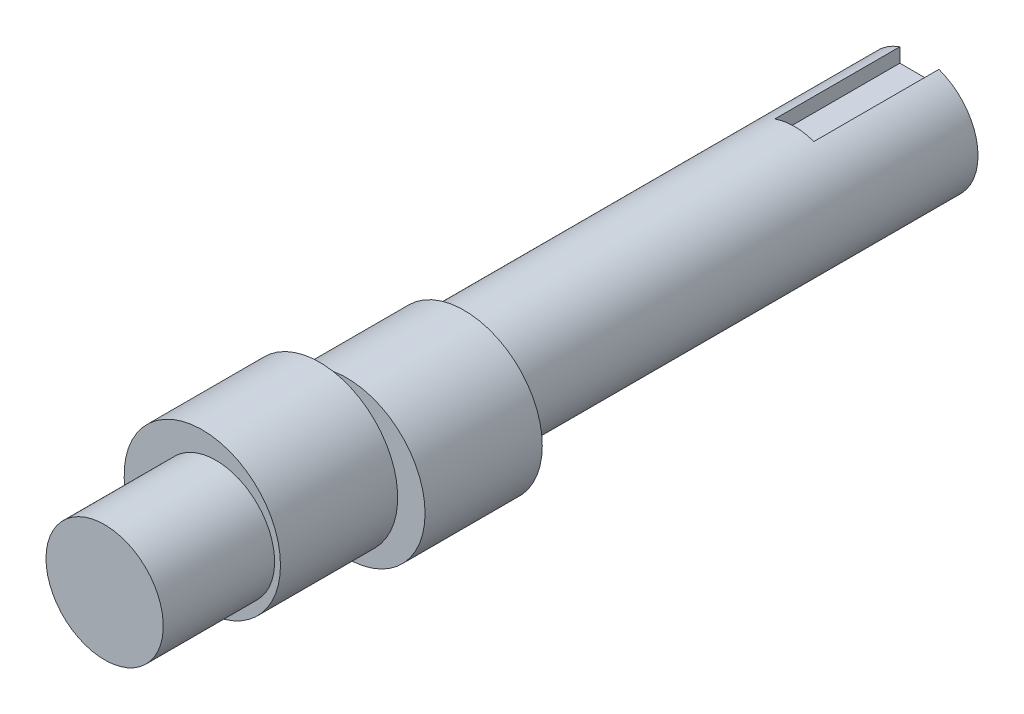
ISO-10303-21;
HEADER;
FILE_DESCRIPTION(('STEP AP214'),'2;1');
FILE_NAME('part.step','',(''),(''),'','','');
FILE_SCHEMA(('AUTOMOTIVE_DESIGN { 1 0 10303 214 1 1 1 1 }'));
ENDSEC;
DATA;
#1=APPLICATION_CONTEXT('core data for automotive mechanical design processes');
#2=APPLICATION_PROTOCOL_DEFINITION('international standard','automotive_design',2000,#1);
#3=PRODUCT_CONTEXT('',#1,'mechanical');
#4=PRODUCT('Part','Part','',(#3));
#5=PRODUCT_RELATED_PRODUCT_CATEGORY('part','',(#4));
#6=PRODUCT_DEFINITION_FORMATION('','',#4);
#7=PRODUCT_DEFINITION_CONTEXT('part definition',#1,'design');
#8=PRODUCT_DEFINITION('design','',#6,#7);
#9=PRODUCT_DEFINITION_SHAPE('','',#8);
#10=(LENGTH_UNIT() NAMED_UNIT(*) SI_UNIT(.MILLI.,.METRE.));
#11=(NAMED_UNIT(*) PLANE_ANGLE_UNIT() SI_UNIT($,.RADIAN.));
#12=(NAMED_UNIT(*) SI_UNIT($,.STERADIAN.) SOLID_ANGLE_UNIT());
#13=UNCERTAINTY_MEASURE_WITH_UNIT(LENGTH_MEASURE(1.E-05),#10,'distance_accuracy_value','');
#14=(GEOMETRIC_REPRESENTATION_CONTEXT(3) GLOBAL_UNCERTAINTY_ASSIGNED_CONTEXT((#13)) GLOBAL_UNIT_ASSIGNED_CONTEXT((#10,
#11,#12)) REPRESENTATION_CONTEXT('',''));
#15=CARTESIAN_POINT('',(0.,0.,0.));
#16=DIRECTION('',(0.,0.,1.));
#17=DIRECTION('',(1.,0.,0.));
#18=AXIS2_PLACEMENT_3D('',#15,#16,#17);
#19=CARTESIAN_POINT('',(0.,0.,60.));
#20=DIRECTION('',(0.,0.,-1.));
#21=DIRECTION('',(-1.,0.,0.));
#22=AXIS2_PLACEMENT_3D('',#19,#20,#21);
#23=CYLINDRICAL_SURFACE('',#22,7.5);
#24=CARTESIAN_POINT('',(0.,0.,60.));
#25=DIRECTION('',(0.,0.,1.));
#26=DIRECTION('',(1.,0.,0.));
#27=AXIS2_PLACEMENT_3D('',#24,#25,#26);
#28=CIRCLE('',#27,7.5);
#29=CARTESIAN_POINT('',(7.5,0.,60.));
#30=VERTEX_POINT('',#29);
#31=EDGE_CURVE('E122',#30,#30,#28,.T.);
#32=ORIENTED_EDGE('',*,*,#31,.F.);
#33=EDGE_LOOP('',(#32));
#34=FACE_BOUND('',#33,.T.);
#35=CARTESIAN_POINT('',(0.,0.,16.));
#36=DIRECTION('',(0.,0.,-1.));
#37=DIRECTION('',(-1.,0.,0.));
#38=AXIS2_PLACEMENT_3D('',#35,#36,#37);
#39=CIRCLE('',#38,7.5);
#40=CARTESIAN_POINT('',(-2.5,7.07106781186548,16.));
#41=VERTEX_POINT('',#40);
#42=CARTESIAN_POINT('',(2.5,7.07106781186548,16.));
#43=VERTEX_POINT('',#42);
#44=EDGE_CURVE('E87',#41,#43,#39,.T.);
#45=ORIENTED_EDGE('',*,*,#44,.F.);
#46=DIRECTION('',(0.,0.,-1.));
#47=VECTOR('',#46,1.);
#48=CARTESIAN_POINT('',(-2.5,7.07106781186548,16.));
#49=LINE('',#48,#47);
#50=CARTESIAN_POINT('',(-2.5,7.07106781186548,0.));
#51=VERTEX_POINT('',#50);
#52=EDGE_CURVE('E109',#41,#51,#49,.T.);
#53=ORIENTED_EDGE('',*,*,#52,.T.);
#54=CARTESIAN_POINT('',(0.,0.,0.));
#55=DIRECTION('',(0.,0.,1.));
#56=DIRECTION('',(1.,0.,0.));
#57=AXIS2_PLACEMENT_3D('',#54,#55,#56);
#58=CIRCLE('',#57,7.5);
#59=CARTESIAN_POINT('',(2.5,7.07106781186547,0.));
#60=VERTEX_POINT('',#59);
#61=EDGE_CURVE('E35',#51,#60,#58,.T.);
#62=ORIENTED_EDGE('',*,*,#61,.T.);
#63=DIRECTION('',(0.,0.,-1.));
#64=VECTOR('',#63,1.);
#65=CARTESIAN_POINT('',(2.5,7.07106781186548,16.));
#66=LINE('',#65,#64);
#67=EDGE_CURVE('E48',#43,#60,#66,.T.);
#68=ORIENTED_EDGE('',*,*,#67,.F.);
#69=EDGE_LOOP('',(#45,#53,#62,#68));
#70=FACE_BOUND('',#69,.T.);
#71=ADVANCED_FACE('F32',(#34,#70),#23,.T.);
#72=CARTESIAN_POINT('',(0.,0.,0.));
#73=DIRECTION('',(0.,0.,1.));
#74=DIRECTION('',(1.,0.,0.));
#75=AXIS2_PLACEMENT_3D('',#72,#73,#74);
#76=PLANE('',#75);
#77=ORIENTED_EDGE('',*,*,#61,.F.);
#78=DIRECTION('',(0.,1.,0.));
#79=VECTOR('',#78,1.);
#80=CARTESIAN_POINT('',(-2.5,5.25,0.));
#81=LINE('',#80,#79);
#82=CARTESIAN_POINT('',(-2.5,5.25,0.));
#83=VERTEX_POINT('',#82);
#84=EDGE_CURVE('E96',#83,#51,#81,.T.);
#85=ORIENTED_EDGE('',*,*,#84,.F.);
#86=DIRECTION('',(-1.,0.,0.));
#87=VECTOR('',#86,1.);
#88=CARTESIAN_POINT('',(2.5,5.25,0.));
#89=LINE('',#88,#87);
#90=CARTESIAN_POINT('',(2.5,5.25,0.));
#91=VERTEX_POINT('',#90);
#92=EDGE_CURVE('E158',#91,#83,#89,.T.);
#93=ORIENTED_EDGE('',*,*,#92,.F.);
#94=DIRECTION('',(0.,-1.,0.));
#95=VECTOR('',#94,1.);
#96=CARTESIAN_POINT('',(2.5,7.07106781186548,0.));
#97=LINE('',#96,#95);
#98=EDGE_CURVE('E156',#60,#91,#97,.T.);
#99=ORIENTED_EDGE('',*,*,#98,.F.);
#100=EDGE_LOOP('',(#77,#85,#93,#99));
#101=FACE_BOUND('',#100,.T.);
#102=ADVANCED_FACE('F143',(#101),#76,.F.);
#103=CARTESIAN_POINT('',(1.75,0.,75.));
#104=DIRECTION('',(0.,0.,-1.));
#105=DIRECTION('',(-1.,0.,0.));
#106=AXIS2_PLACEMENT_3D('',#103,#104,#105);
#107=CYLINDRICAL_SURFACE('',#106,10.);
#108=CARTESIAN_POINT('',(1.75,0.,75.));
#109=DIRECTION('',(0.,0.,1.));
#110=DIRECTION('',(1.,0.,0.));
#111=AXIS2_PLACEMENT_3D('',#108,#109,#110);
#112=CIRCLE('',#111,10.);
#113=CARTESIAN_POINT('',(0.,9.84568433375761,75.));
#114=VERTEX_POINT('',#113);
#115=CARTESIAN_POINT('',(0.,-9.84568433375761,75.));
#116=VERTEX_POINT('',#115);
#117=EDGE_CURVE('E117',#114,#116,#112,.T.);
#118=ORIENTED_EDGE('',*,*,#117,.F.);
#119=EDGE_CURVE('E120',#116,#114,#112,.T.);
#120=ORIENTED_EDGE('',*,*,#119,.F.);
#121=EDGE_LOOP('',(#118,#120));
#122=FACE_BOUND('',#121,.T.);
#123=CARTESIAN_POINT('',(1.75,0.,60.));
#124=DIRECTION('',(0.,0.,1.));
#125=DIRECTION('',(1.,0.,0.));
#126=AXIS2_PLACEMENT_3D('',#123,#124,#125);
#127=CIRCLE('',#126,10.);
#128=CARTESIAN_POINT('',(11.75,0.,60.));
#129=VERTEX_POINT('',#128);
#130=EDGE_CURVE('E114',#129,#129,#127,.T.);
#131=ORIENTED_EDGE('',*,*,#130,.T.);
#132=EDGE_LOOP('',(#131));
#133=FACE_BOUND('',#132,.T.);
#134=ADVANCED_FACE('F132',(#122,#133),#107,.T.);
#135=CARTESIAN_POINT('',(1.75,0.,75.));
#136=DIRECTION('',(0.,0.,1.));
#137=DIRECTION('',(1.,0.,0.));
#138=AXIS2_PLACEMENT_3D('',#135,#136,#137);
#139=PLANE('',#138);
#140=CARTESIAN_POINT('',(-1.75,0.,75.));
#141=DIRECTION('',(0.,0.,1.));
#142=DIRECTION('',(1.,0.,0.));
#143=AXIS2_PLACEMENT_3D('',#140,#141,#142);
#144=CIRCLE('',#143,10.);
#145=EDGE_CURVE('E40',#116,#114,#144,.T.);
#146=ORIENTED_EDGE('',*,*,#145,.F.);
#147=ORIENTED_EDGE('',*,*,#119,.T.);
#148=EDGE_LOOP('',(#146,#147));
#149=FACE_BOUND('',#148,.T.);
#150=ADVANCED_FACE('F134',(#149),#139,.T.);
#151=CARTESIAN_POINT('',(1.75,0.,60.));
#152=DIRECTION('',(0.,0.,1.));
#153=DIRECTION('',(1.,0.,0.));
#154=AXIS2_PLACEMENT_3D('',#151,#152,#153);
#155=PLANE('',#154);
#156=ORIENTED_EDGE('',*,*,#31,.T.);
#157=EDGE_LOOP('',(#156));
#158=FACE_BOUND('',#157,.T.);
#159=ORIENTED_EDGE('',*,*,#130,.F.);
#160=EDGE_LOOP('',(#159));
#161=FACE_BOUND('',#160,.T.);
#162=ADVANCED_FACE('F136',(#158,#161),#155,.F.);
#163=CARTESIAN_POINT('',(-1.75,0.,75.));
#164=DIRECTION('',(0.,0.,1.));
#165=DIRECTION('',(1.,0.,0.));
#166=AXIS2_PLACEMENT_3D('',#163,#164,#165);
#167=PLANE('',#166);
#168=EDGE_CURVE('E108',#114,#116,#144,.T.);
#169=ORIENTED_EDGE('',*,*,#168,.F.);
#170=ORIENTED_EDGE('',*,*,#117,.T.);
#171=EDGE_LOOP('',(#169,#170));
#172=FACE_BOUND('',#171,.T.);
#173=ADVANCED_FACE('F130',(#172),#167,.F.);
#174=CARTESIAN_POINT('',(-1.75,0.,90.));
#175=DIRECTION('',(0.,0.,-1.));
#176=DIRECTION('',(-1.,0.,0.));
#177=AXIS2_PLACEMENT_3D('',#174,#175,#176);
#178=CYLINDRICAL_SURFACE('',#177,10.);
#179=CARTESIAN_POINT('',(-1.75,0.,90.));
#180=DIRECTION('',(0.,0.,1.));
#181=DIRECTION('',(1.,0.,0.));
#182=AXIS2_PLACEMENT_3D('',#179,#180,#181);
#183=CIRCLE('',#182,10.);
#184=CARTESIAN_POINT('',(8.25,0.,90.));
#185=VERTEX_POINT('',#184);
#186=EDGE_CURVE('E111',#185,#185,#183,.T.);
#187=ORIENTED_EDGE('',*,*,#186,.F.);
#188=EDGE_LOOP('',(#187));
#189=FACE_BOUND('',#188,.T.);
#190=ORIENTED_EDGE('',*,*,#168,.T.);
#191=ORIENTED_EDGE('',*,*,#145,.T.);
#192=EDGE_LOOP('',(#190,#191));
#193=FACE_BOUND('',#192,.T.);
#194=ADVANCED_FACE('F128',(#189,#193),#178,.T.);
#195=CARTESIAN_POINT('',(-1.75,0.,90.));
#196=DIRECTION('',(0.,0.,1.));
#197=DIRECTION('',(1.,0.,0.));
#198=AXIS2_PLACEMENT_3D('',#195,#196,#197);
#199=PLANE('',#198);
#200=CARTESIAN_POINT('',(0.,0.,90.));
#201=DIRECTION('',(0.,0.,1.));
#202=DIRECTION('',(1.,0.,0.));
#203=AXIS2_PLACEMENT_3D('',#200,#201,#202);
#204=CIRCLE('',#203,7.5);
#205=CARTESIAN_POINT('',(-7.5,0.,90.));
#206=VERTEX_POINT('',#205);
#207=EDGE_CURVE('E11',#206,#206,#204,.T.);
#208=ORIENTED_EDGE('',*,*,#207,.F.);
#209=EDGE_LOOP('',(#208));
#210=FACE_BOUND('',#209,.T.);
#211=ORIENTED_EDGE('',*,*,#186,.T.);
#212=EDGE_LOOP('',(#211));
#213=FACE_BOUND('',#212,.T.);
#214=ADVANCED_FACE('F185',(#210,#213),#199,.T.);
#215=CARTESIAN_POINT('',(0.,0.,104.25));
#216=DIRECTION('',(0.,0.,-1.));
#217=DIRECTION('',(-1.,0.,0.));
#218=AXIS2_PLACEMENT_3D('',#215,#216,#217);
#219=CYLINDRICAL_SURFACE('',#218,7.5);
#220=CARTESIAN_POINT('',(0.,0.,104.25));
#221=DIRECTION('',(0.,0.,1.));
#222=DIRECTION('',(1.,0.,0.));
#223=AXIS2_PLACEMENT_3D('',#220,#221,#222);
#224=CIRCLE('',#223,7.5);
#225=CARTESIAN_POINT('',(-7.5,0.,104.25));
#226=VERTEX_POINT('',#225);
#227=EDGE_CURVE('E106',#226,#226,#224,.T.);
#228=CARTESIAN_POINT('',(-7.5,0.,104.25));
#229=CARTESIAN_POINT('',(-7.5,0.,104.1015625));
#230=CARTESIAN_POINT('',(-7.5,0.,103.953125));
#231=CARTESIAN_POINT('',(-7.5,0.,103.65625));
#232=CARTESIAN_POINT('',(-7.5,0.,103.5078125));
#233=CARTESIAN_POINT('',(-7.5,0.,103.2109375));
#234=CARTESIAN_POINT('',(-7.5,0.,103.0625));
#235=CARTESIAN_POINT('',(-7.5,0.,102.765625));
#236=CARTESIAN_POINT('',(-7.5,0.,102.6171875));
#237=CARTESIAN_POINT('',(-7.5,0.,102.3203125));
#238=CARTESIAN_POINT('',(-7.5,0.,102.171875));
#239=CARTESIAN_POINT('',(-7.5,0.,101.875));
#240=CARTESIAN_POINT('',(-7.5,0.,101.7265625));
#241=CARTESIAN_POINT('',(-7.5,0.,101.4296875));
#242=CARTESIAN_POINT('',(-7.5,0.,101.28125));
#243=CARTESIAN_POINT('',(-7.5,0.,100.984375));
#244=CARTESIAN_POINT('',(-7.5,0.,100.8359375));
#245=CARTESIAN_POINT('',(-7.5,0.,100.5390625));
#246=CARTESIAN_POINT('',(-7.5,0.,100.390625));
#247=CARTESIAN_POINT('',(-7.5,0.,100.09375));
#248=CARTESIAN_POINT('',(-7.5,0.,99.9453125));
#249=CARTESIAN_POINT('',(-7.5,0.,99.6484375));
#250=CARTESIAN_POINT('',(-7.5,0.,99.5));
#251=CARTESIAN_POINT('',(-7.5,0.,99.203125));
#252=CARTESIAN_POINT('',(-7.5,0.,99.0546875));
#253=CARTESIAN_POINT('',(-7.5,0.,98.7578125));
#254=CARTESIAN_POINT('',(-7.5,0.,98.609375));
#255=CARTESIAN_POINT('',(-7.5,0.,98.3125));
#256=CARTESIAN_POINT('',(-7.5,0.,98.1640625));
#257=CARTESIAN_POINT('',(-7.5,0.,97.8671875));
#258=CARTESIAN_POINT('',(-7.5,0.,97.71875));
#259=CARTESIAN_POINT('',(-7.5,0.,97.421875));
#260=CARTESIAN_POINT('',(-7.5,0.,97.2734375));
#261=CARTESIAN_POINT('',(-7.5,0.,96.9765625));
#262=CARTESIAN_POINT('',(-7.5,0.,96.828125));
#263=CARTESIAN_POINT('',(-7.5,0.,96.53125));
#264=CARTESIAN_POINT('',(-7.5,0.,96.3828125));
#265=CARTESIAN_POINT('',(-7.5,0.,96.0859375));
#266=CARTESIAN_POINT('',(-7.5,0.,95.9375));
#267=CARTESIAN_POINT('',(-7.5,0.,95.640625));
#268=CARTESIAN_POINT('',(-7.5,0.,95.4921875));
#269=CARTESIAN_POINT('',(-7.5,0.,95.1953125));
#270=CARTESIAN_POINT('',(-7.5,0.,95.046875));
#271=CARTESIAN_POINT('',(-7.5,0.,94.75));
#272=CARTESIAN_POINT('',(-7.5,0.,94.6015625));
#273=CARTESIAN_POINT('',(-7.5,0.,94.3046875));
#274=CARTESIAN_POINT('',(-7.5,0.,94.15625));
#275=CARTESIAN_POINT('',(-7.5,0.,93.859375));
#276=CARTESIAN_POINT('',(-7.5,0.,93.7109375));
#277=CARTESIAN_POINT('',(-7.5,0.,93.4140625));
#278=CARTESIAN_POINT('',(-7.5,0.,93.265625));
#279=CARTESIAN_POINT('',(-7.5,0.,92.96875));
#280=CARTESIAN_POINT('',(-7.5,0.,92.8203125));
#281=CARTESIAN_POINT('',(-7.5,0.,92.5234375));
#282=CARTESIAN_POINT('',(-7.5,0.,92.375));
#283=CARTESIAN_POINT('',(-7.5,0.,92.078125));
#284=CARTESIAN_POINT('',(-7.5,0.,91.9296875));
#285=CARTESIAN_POINT('',(-7.5,0.,91.6328125));
#286=CARTESIAN_POINT('',(-7.5,0.,91.484375));
#287=CARTESIAN_POINT('',(-7.5,0.,91.1875));
#288=CARTESIAN_POINT('',(-7.5,0.,91.0390625));
#289=CARTESIAN_POINT('',(-7.5,0.,90.7421875));
#290=CARTESIAN_POINT('',(-7.5,0.,90.59375));
#291=CARTESIAN_POINT('',(-7.5,0.,90.296875));
#292=CARTESIAN_POINT('',(-7.5,0.,90.1484375));
#293=CARTESIAN_POINT('',(-7.5,0.,90.));
#294=B_SPLINE_CURVE_WITH_KNOTS('',3,(#228,#229,#230,#231,#232,#233,#234,#235,#236,#237,#238,
#239,#240,#241,#242,#243,#244,#245,#246,#247,#248,#249,#250,#251,#252,#253,#254,#255,#256,#257,
#258,#259,#260,#261,#262,#263,#264,#265,#266,#267,#268,#269,#270,#271,#272,#273,#274,#275,#276,
#277,#278,#279,#280,#281,#282,#283,#284,#285,#286,#287,#288,#289,#290,#291,#292,#293),
.UNSPECIFIED.,.F.,.F.,(4,2,2,2,2,2,2,2,2,2,2,2,2,2,2,2,2,2,2,2,2,2,2,2,2,2,2,2,2,2,2,2,4),(0.,
0.445312500000003,0.890625000000006,1.33593750000001,1.78125000000001,2.2265625,2.671875,
3.11718750000001,3.56250000000001,4.00781250000001,4.453125,4.89843750000001,5.34375000000001,
5.78906250000001,6.234375,6.6796875,7.12500000000001,7.57031250000001,8.01562500000001,
8.4609375,8.90625,9.35156250000001,9.79687500000001,10.2421875,10.6875,11.1328125,11.578125,
12.0234375,12.46875,12.9140625,13.359375,13.8046875,14.25),.UNSPECIFIED.);
#295=EDGE_CURVE('BSEAM181',#226,#206,#294,.T.);
#296=ORIENTED_EDGE('',*,*,#227,.F.);
#297=ORIENTED_EDGE('',*,*,#207,.T.);
#298=ORIENTED_EDGE('',*,*,#295,.T.);
#299=ORIENTED_EDGE('',*,*,#295,.F.);
#300=EDGE_LOOP('',(#296,#298,#297,#299));
#301=FACE_BOUND('',#300,.T.);
#302=ADVANCED_FACE('F181',(#301),#219,.T.);
#303=CARTESIAN_POINT('',(0.,0.,104.25));
#304=DIRECTION('',(0.,0.,1.));
#305=DIRECTION('',(1.,0.,0.));
#306=AXIS2_PLACEMENT_3D('',#303,#304,#305);
#307=PLANE('',#306);
#308=ORIENTED_EDGE('',*,*,#227,.T.);
#309=EDGE_LOOP('',(#308));
#310=FACE_BOUND('',#309,.T.);
#311=ADVANCED_FACE('F175',(#310),#307,.T.);
#312=CARTESIAN_POINT('',(-2.5,5.25,16.));
#313=DIRECTION('',(-1.,0.,0.));
#314=DIRECTION('',(0.,0.,1.));
#315=AXIS2_PLACEMENT_3D('',#312,#313,#314);
#316=PLANE('',#315);
#317=ORIENTED_EDGE('',*,*,#84,.T.);
#318=ORIENTED_EDGE('',*,*,#52,.F.);
#319=DIRECTION('',(0.,1.,0.));
#320=VECTOR('',#319,1.);
#321=CARTESIAN_POINT('',(-2.5,5.25,16.));
#322=LINE('',#321,#320);
#323=CARTESIAN_POINT('',(-2.5,5.25,16.));
#324=VERTEX_POINT('',#323);
#325=EDGE_CURVE('E93',#324,#41,#322,.T.);
#326=ORIENTED_EDGE('',*,*,#325,.F.);
#327=DIRECTION('',(0.,0.,-1.));
#328=VECTOR('',#327,1.);
#329=CARTESIAN_POINT('',(-2.5,5.25,16.));
#330=LINE('',#329,#328);
#331=EDGE_CURVE('E101',#324,#83,#330,.T.);
#332=ORIENTED_EDGE('',*,*,#331,.T.);
#333=EDGE_LOOP('',(#317,#318,#326,#332));
#334=FACE_BOUND('',#333,.T.);
#335=ADVANCED_FACE('F165',(#334),#316,.F.);
#336=CARTESIAN_POINT('',(2.5,5.25,16.));
#337=DIRECTION('',(0.,-1.,0.));
#338=DIRECTION('',(0.,0.,-1.));
#339=AXIS2_PLACEMENT_3D('',#336,#337,#338);
#340=PLANE('',#339);
#341=ORIENTED_EDGE('',*,*,#92,.T.);
#342=ORIENTED_EDGE('',*,*,#331,.F.);
#343=DIRECTION('',(-1.,0.,0.));
#344=VECTOR('',#343,1.);
#345=CARTESIAN_POINT('',(2.5,5.25,16.));
#346=LINE('',#345,#344);
#347=CARTESIAN_POINT('',(2.5,5.25,16.));
#348=VERTEX_POINT('',#347);
#349=EDGE_CURVE('E86',#348,#324,#346,.T.);
#350=ORIENTED_EDGE('',*,*,#349,.F.);
#351=DIRECTION('',(0.,0.,-1.));
#352=VECTOR('',#351,1.);
#353=CARTESIAN_POINT('',(2.5,5.25,16.));
#354=LINE('',#353,#352);
#355=EDGE_CURVE('E82',#348,#91,#354,.T.);
#356=ORIENTED_EDGE('',*,*,#355,.T.);
#357=EDGE_LOOP('',(#341,#342,#350,#356));
#358=FACE_BOUND('',#357,.T.);
#359=ADVANCED_FACE('F167',(#358),#340,.F.);
#360=CARTESIAN_POINT('',(2.5,7.07106781186548,16.));
#361=DIRECTION('',(1.,0.,0.));
#362=DIRECTION('',(0.,1.,0.));
#363=AXIS2_PLACEMENT_3D('',#360,#361,#362);
#364=PLANE('',#363);
#365=ORIENTED_EDGE('',*,*,#98,.T.);
#366=ORIENTED_EDGE('',*,*,#355,.F.);
#367=DIRECTION('',(0.,-1.,0.));
#368=VECTOR('',#367,1.);
#369=CARTESIAN_POINT('',(2.5,7.07106781186548,16.));
#370=LINE('',#369,#368);
#371=EDGE_CURVE('E79',#43,#348,#370,.T.);
#372=ORIENTED_EDGE('',*,*,#371,.F.);
#373=ORIENTED_EDGE('',*,*,#67,.T.);
#374=EDGE_LOOP('',(#365,#366,#372,#373));
#375=FACE_BOUND('',#374,.T.);
#376=ADVANCED_FACE('F81',(#375),#364,.F.);
#377=CARTESIAN_POINT('',(0.,0.,16.));
#378=DIRECTION('',(0.,0.,-1.));
#379=DIRECTION('',(-1.,0.,0.));
#380=AXIS2_PLACEMENT_3D('',#377,#378,#379);
#381=PLANE('',#380);
#382=ORIENTED_EDGE('',*,*,#44,.T.);
#383=ORIENTED_EDGE('',*,*,#371,.T.);
#384=ORIENTED_EDGE('',*,*,#349,.T.);
#385=ORIENTED_EDGE('',*,*,#325,.T.);
#386=EDGE_LOOP('',(#382,#383,#384,#385));
#387=FACE_BOUND('',#386,.T.);
#388=ADVANCED_FACE('F91',(#387),#381,.T.);
#389=CLOSED_SHELL('',(#71,#102,#134,#150,#162,#173,#194,#214,#302,#311,#335,#359,#376,#388));
#390=MANIFOLD_SOLID_BREP('B2',#389);
#391=ADVANCED_BREP_SHAPE_REPRESENTATION('',(#18,#390),#14);
#392=SHAPE_DEFINITION_REPRESENTATION(#9,#391);
ENDSEC;
END-ISO-10303-21;
